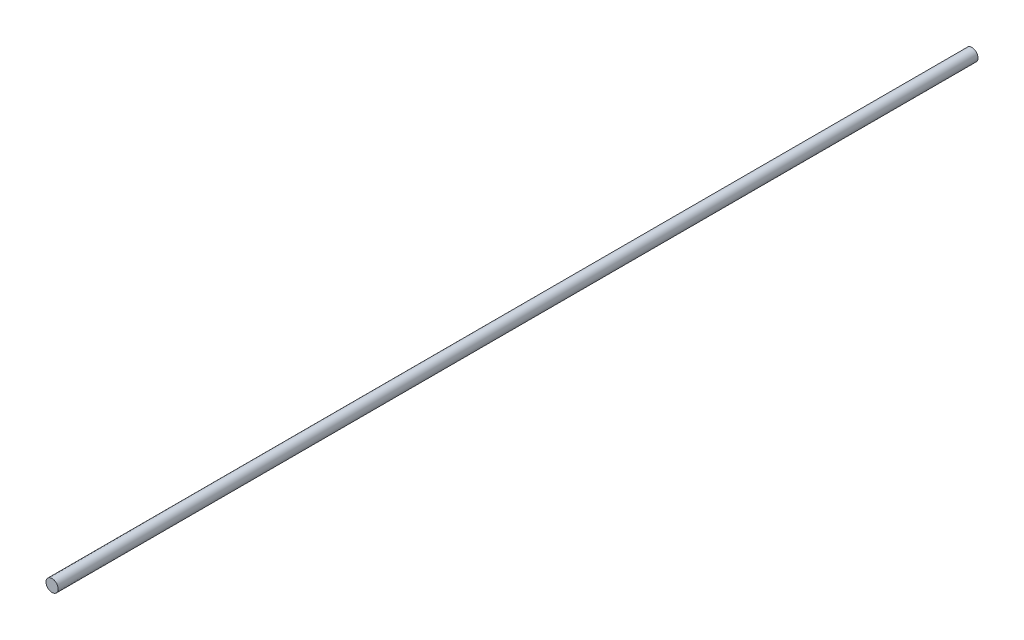
ISO-10303-21;
HEADER;
FILE_DESCRIPTION(('STEP AP214'),'2;1');
FILE_NAME('part.step','',(''),(''),'','','');
FILE_SCHEMA(('AUTOMOTIVE_DESIGN { 1 0 10303 214 1 1 1 1 }'));
ENDSEC;
DATA;
#1=APPLICATION_CONTEXT('core data for automotive mechanical design processes');
#2=APPLICATION_PROTOCOL_DEFINITION('international standard','automotive_design',2000,#1);
#3=PRODUCT_CONTEXT('',#1,'mechanical');
#4=PRODUCT('Part','Part','',(#3));
#5=PRODUCT_RELATED_PRODUCT_CATEGORY('part','',(#4));
#6=PRODUCT_DEFINITION_FORMATION('','',#4);
#7=PRODUCT_DEFINITION_CONTEXT('part definition',#1,'design');
#8=PRODUCT_DEFINITION('design','',#6,#7);
#9=PRODUCT_DEFINITION_SHAPE('','',#8);
#10=(LENGTH_UNIT() NAMED_UNIT(*) SI_UNIT(.MILLI.,.METRE.));
#11=(NAMED_UNIT(*) PLANE_ANGLE_UNIT() SI_UNIT($,.RADIAN.));
#12=(NAMED_UNIT(*) SI_UNIT($,.STERADIAN.) SOLID_ANGLE_UNIT());
#13=UNCERTAINTY_MEASURE_WITH_UNIT(LENGTH_MEASURE(1.E-05),#10,'distance_accuracy_value','');
#14=(GEOMETRIC_REPRESENTATION_CONTEXT(3) GLOBAL_UNCERTAINTY_ASSIGNED_CONTEXT((#13)) GLOBAL_UNIT_ASSIGNED_CONTEXT((#10,
#11,#12)) REPRESENTATION_CONTEXT('',''));
#15=CARTESIAN_POINT('',(0.,0.,0.));
#16=DIRECTION('',(0.,0.,1.));
#17=DIRECTION('',(1.,0.,0.));
#18=AXIS2_PLACEMENT_3D('',#15,#16,#17);
#19=CARTESIAN_POINT('',(0.,0.,300.));
#20=DIRECTION('',(0.,0.,-1.));
#21=DIRECTION('',(-1.,0.,0.));
#22=AXIS2_PLACEMENT_3D('',#19,#20,#21);
#23=CYLINDRICAL_SURFACE('',#22,1.985);
#24=CARTESIAN_POINT('',(0.,0.,300.));
#25=DIRECTION('',(0.,0.,1.));
#26=DIRECTION('',(1.,0.,0.));
#27=AXIS2_PLACEMENT_3D('',#24,#25,#26);
#28=CIRCLE('',#27,1.985);
#29=CARTESIAN_POINT('',(1.985,0.,300.));
#30=VERTEX_POINT('',#29);
#31=EDGE_CURVE('E10',#30,#30,#28,.T.);
#32=ORIENTED_EDGE('',*,*,#31,.F.);
#33=EDGE_LOOP('',(#32));
#34=FACE_BOUND('',#33,.T.);
#35=CARTESIAN_POINT('',(0.,0.,0.));
#36=DIRECTION('',(0.,0.,1.));
#37=DIRECTION('',(1.,0.,0.));
#38=AXIS2_PLACEMENT_3D('',#35,#36,#37);
#39=CIRCLE('',#38,1.985);
#40=CARTESIAN_POINT('',(1.985,0.,0.));
#41=VERTEX_POINT('',#40);
#42=EDGE_CURVE('E46',#41,#41,#39,.T.);
#43=ORIENTED_EDGE('',*,*,#42,.T.);
#44=EDGE_LOOP('',(#43));
#45=FACE_BOUND('',#44,.T.);
#46=ADVANCED_FACE('F43',(#34,#45),#23,.T.);
#47=CARTESIAN_POINT('',(0.,0.,300.));
#48=DIRECTION('',(0.,0.,1.));
#49=DIRECTION('',(1.,0.,0.));
#50=AXIS2_PLACEMENT_3D('',#47,#48,#49);
#51=PLANE('',#50);
#52=ORIENTED_EDGE('',*,*,#31,.T.);
#53=EDGE_LOOP('',(#52));
#54=FACE_BOUND('',#53,.T.);
#55=ADVANCED_FACE('F60',(#54),#51,.T.);
#56=CARTESIAN_POINT('',(0.,0.,0.));
#57=DIRECTION('',(0.,0.,1.));
#58=DIRECTION('',(1.,0.,0.));
#59=AXIS2_PLACEMENT_3D('',#56,#57,#58);
#60=PLANE('',#59);
#61=ORIENTED_EDGE('',*,*,#42,.F.);
#62=EDGE_LOOP('',(#61));
#63=FACE_BOUND('',#62,.T.);
#64=ADVANCED_FACE('F58',(#63),#60,.F.);
#65=CLOSED_SHELL('',(#46,#55,#64));
#66=MANIFOLD_SOLID_BREP('B2',#65);
#67=ADVANCED_BREP_SHAPE_REPRESENTATION('',(#18,#66),#14);
#68=SHAPE_DEFINITION_REPRESENTATION(#9,#67);
ENDSEC;
END-ISO-10303-21;
